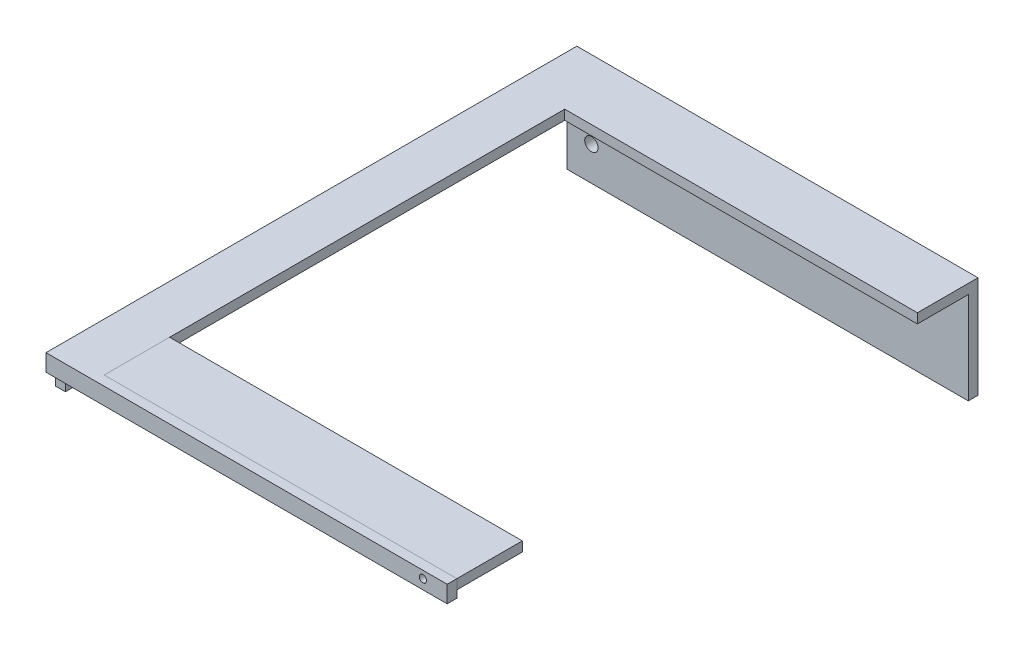
ISO-10303-21;
HEADER;
FILE_DESCRIPTION(('STEP AP214'),'2;1');
FILE_NAME('part.step','',(''),(''),'','','');
FILE_SCHEMA(('AUTOMOTIVE_DESIGN { 1 0 10303 214 1 1 1 1 }'));
ENDSEC;
DATA;
#1=APPLICATION_CONTEXT('core data for automotive mechanical design processes');
#2=APPLICATION_PROTOCOL_DEFINITION('international standard','automotive_design',2000,#1);
#3=PRODUCT_CONTEXT('',#1,'mechanical');
#4=PRODUCT('Part','Part','',(#3));
#5=PRODUCT_RELATED_PRODUCT_CATEGORY('part','',(#4));
#6=PRODUCT_DEFINITION_FORMATION('','',#4);
#7=PRODUCT_DEFINITION_CONTEXT('part definition',#1,'design');
#8=PRODUCT_DEFINITION('design','',#6,#7);
#9=PRODUCT_DEFINITION_SHAPE('','',#8);
#10=(LENGTH_UNIT() NAMED_UNIT(*) SI_UNIT(.MILLI.,.METRE.));
#11=(NAMED_UNIT(*) PLANE_ANGLE_UNIT() SI_UNIT($,.RADIAN.));
#12=(NAMED_UNIT(*) SI_UNIT($,.STERADIAN.) SOLID_ANGLE_UNIT());
#13=UNCERTAINTY_MEASURE_WITH_UNIT(LENGTH_MEASURE(1.E-05),#10,'distance_accuracy_value','');
#14=(GEOMETRIC_REPRESENTATION_CONTEXT(3) GLOBAL_UNCERTAINTY_ASSIGNED_CONTEXT((#13)) GLOBAL_UNIT_ASSIGNED_CONTEXT((#10,
#11,#12)) REPRESENTATION_CONTEXT('',''));
#15=CARTESIAN_POINT('',(0.,0.,0.));
#16=DIRECTION('',(0.,0.,1.));
#17=DIRECTION('',(1.,0.,0.));
#18=AXIS2_PLACEMENT_3D('',#15,#16,#17);
#19=CARTESIAN_POINT('',(20.,0.,215.));
#20=DIRECTION('',(-1.,0.,0.));
#21=DIRECTION('',(0.,0.,1.));
#22=AXIS2_PLACEMENT_3D('',#19,#20,#21);
#23=PLANE('',#22);
#24=DIRECTION('',(0.,0.,1.));
#25=VECTOR('',#24,1.);
#26=CARTESIAN_POINT('',(20.,4.,215.));
#27=LINE('',#26,#25);
#28=CARTESIAN_POINT('',(20.,4.,188.));
#29=VERTEX_POINT('',#28);
#30=CARTESIAN_POINT('',(20.,4.,215.));
#31=VERTEX_POINT('',#30);
#32=EDGE_CURVE('E142',#29,#31,#27,.T.);
#33=ORIENTED_EDGE('',*,*,#32,.F.);
#34=DIRECTION('',(0.,1.,0.));
#35=VECTOR('',#34,1.);
#36=CARTESIAN_POINT('',(20.,0.,188.));
#37=LINE('',#36,#35);
#38=CARTESIAN_POINT('',(20.,0.,188.));
#39=VERTEX_POINT('',#38);
#40=EDGE_CURVE('E77',#39,#29,#37,.T.);
#41=ORIENTED_EDGE('',*,*,#40,.F.);
#42=DIRECTION('',(0.,0.,1.));
#43=VECTOR('',#42,1.);
#44=CARTESIAN_POINT('',(20.,0.,215.));
#45=LINE('',#44,#43);
#46=CARTESIAN_POINT('',(20.,0.,215.));
#47=VERTEX_POINT('',#46);
#48=EDGE_CURVE('E133',#39,#47,#45,.T.);
#49=ORIENTED_EDGE('',*,*,#48,.T.);
#50=DIRECTION('',(0.,1.,0.));
#51=VECTOR('',#50,1.);
#52=CARTESIAN_POINT('',(20.,0.,215.));
#53=LINE('',#52,#51);
#54=EDGE_CURVE('E103',#47,#31,#53,.T.);
#55=ORIENTED_EDGE('',*,*,#54,.T.);
#56=EDGE_LOOP('',(#33,#41,#49,#55));
#57=FACE_BOUND('',#56,.T.);
#58=ADVANCED_FACE('F55',(#57),#23,.T.);
#59=CARTESIAN_POINT('',(20.,0.,188.));
#60=DIRECTION('',(0.,0.,-1.));
#61=DIRECTION('',(-1.,0.,0.));
#62=AXIS2_PLACEMENT_3D('',#59,#60,#61);
#63=PLANE('',#62);
#64=DIRECTION('',(-1.,0.,0.));
#65=VECTOR('',#64,1.);
#66=CARTESIAN_POINT('',(20.,4.,188.));
#67=LINE('',#66,#65);
#68=CARTESIAN_POINT('',(165.5,4.,188.));
#69=VERTEX_POINT('',#68);
#70=EDGE_CURVE('E135',#69,#29,#67,.T.);
#71=ORIENTED_EDGE('',*,*,#70,.F.);
#72=DIRECTION('',(0.,1.,0.));
#73=VECTOR('',#72,1.);
#74=CARTESIAN_POINT('',(165.5,0.,188.));
#75=LINE('',#74,#73);
#76=CARTESIAN_POINT('',(165.5,0.,188.));
#77=VERTEX_POINT('',#76);
#78=EDGE_CURVE('E154',#77,#69,#75,.T.);
#79=ORIENTED_EDGE('',*,*,#78,.F.);
#80=DIRECTION('',(-1.,0.,0.));
#81=VECTOR('',#80,1.);
#82=CARTESIAN_POINT('',(20.,0.,188.));
#83=LINE('',#82,#81);
#84=EDGE_CURVE('E140',#77,#39,#83,.T.);
#85=ORIENTED_EDGE('',*,*,#84,.T.);
#86=ORIENTED_EDGE('',*,*,#40,.T.);
#87=EDGE_LOOP('',(#71,#79,#85,#86));
#88=FACE_BOUND('',#87,.T.);
#89=ADVANCED_FACE('F162',(#88),#63,.T.);
#90=CARTESIAN_POINT('',(165.5,0.,215.));
#91=DIRECTION('',(1.,0.,0.));
#92=DIRECTION('',(0.,0.,-1.));
#93=AXIS2_PLACEMENT_3D('',#90,#91,#92);
#94=PLANE('',#93);
#95=DIRECTION('',(0.,0.,-1.));
#96=VECTOR('',#95,1.);
#97=CARTESIAN_POINT('',(165.5,4.,215.));
#98=LINE('',#97,#96);
#99=CARTESIAN_POINT('',(165.5,4.,215.));
#100=VERTEX_POINT('',#99);
#101=EDGE_CURVE('E148',#100,#69,#98,.T.);
#102=ORIENTED_EDGE('',*,*,#101,.F.);
#103=DIRECTION('',(0.,1.,0.));
#104=VECTOR('',#103,1.);
#105=CARTESIAN_POINT('',(165.5,0.,215.));
#106=LINE('',#105,#104);
#107=CARTESIAN_POINT('',(165.5,0.,215.));
#108=VERTEX_POINT('',#107);
#109=EDGE_CURVE('E156',#108,#100,#106,.T.);
#110=ORIENTED_EDGE('',*,*,#109,.F.);
#111=DIRECTION('',(0.,0.,-1.));
#112=VECTOR('',#111,1.);
#113=CARTESIAN_POINT('',(165.5,0.,215.));
#114=LINE('',#113,#112);
#115=EDGE_CURVE('E130',#108,#77,#114,.T.);
#116=ORIENTED_EDGE('',*,*,#115,.T.);
#117=ORIENTED_EDGE('',*,*,#78,.T.);
#118=EDGE_LOOP('',(#102,#110,#116,#117));
#119=FACE_BOUND('',#118,.T.);
#120=ADVANCED_FACE('F164',(#119),#94,.T.);
#121=CARTESIAN_POINT('',(20.,0.,215.));
#122=DIRECTION('',(0.,0.,1.));
#123=DIRECTION('',(1.,0.,0.));
#124=AXIS2_PLACEMENT_3D('',#121,#122,#123);
#125=PLANE('',#124);
#126=CARTESIAN_POINT('',(155.5,1.,215.));
#127=DIRECTION('',(0.,0.,1.));
#128=DIRECTION('',(1.,0.,0.));
#129=AXIS2_PLACEMENT_3D('',#126,#127,#128);
#130=CIRCLE('',#129,1.5);
#131=CARTESIAN_POINT('',(156.61803398875,0.,215.));
#132=VERTEX_POINT('',#131);
#133=CARTESIAN_POINT('',(154.38196601125,0.,215.));
#134=VERTEX_POINT('',#133);
#135=EDGE_CURVE('E122',#132,#134,#130,.T.);
#136=ORIENTED_EDGE('',*,*,#135,.F.);
#137=DIRECTION('',(1.,0.,0.));
#138=VECTOR('',#137,1.);
#139=CARTESIAN_POINT('',(20.,0.,215.));
#140=LINE('',#139,#138);
#141=EDGE_CURVE('E127',#132,#108,#140,.T.);
#142=ORIENTED_EDGE('',*,*,#141,.T.);
#143=ORIENTED_EDGE('',*,*,#109,.T.);
#144=DIRECTION('',(1.,0.,0.));
#145=VECTOR('',#144,1.);
#146=CARTESIAN_POINT('',(20.,4.,215.));
#147=LINE('',#146,#145);
#148=EDGE_CURVE('E145',#31,#100,#147,.T.);
#149=ORIENTED_EDGE('',*,*,#148,.F.);
#150=ORIENTED_EDGE('',*,*,#54,.F.);
#151=EDGE_CURVE('E132',#47,#134,#140,.T.);
#152=ORIENTED_EDGE('',*,*,#151,.T.);
#153=EDGE_LOOP('',(#136,#142,#143,#149,#150,#152));
#154=FACE_BOUND('',#153,.T.);
#155=ADVANCED_FACE('F158',(#154),#125,.T.);
#156=CARTESIAN_POINT('',(0.,0.,0.));
#157=DIRECTION('',(0.,-1.,0.));
#158=DIRECTION('',(0.,0.,-1.));
#159=AXIS2_PLACEMENT_3D('',#156,#157,#158);
#160=PLANE('',#159);
#161=DIRECTION('',(0.,0.,1.));
#162=VECTOR('',#161,1.);
#163=CARTESIAN_POINT('',(156.61803398875,0.,199.));
#164=LINE('',#163,#162);
#165=CARTESIAN_POINT('',(156.61803398875,0.,199.));
#166=VERTEX_POINT('',#165);
#167=EDGE_CURVE('E12',#166,#132,#164,.T.);
#168=ORIENTED_EDGE('',*,*,#167,.F.);
#169=DIRECTION('',(-1.,0.,0.));
#170=VECTOR('',#169,1.);
#171=CARTESIAN_POINT('',(0.,0.,199.));
#172=LINE('',#171,#170);
#173=CARTESIAN_POINT('',(154.38196601125,0.,199.));
#174=VERTEX_POINT('',#173);
#175=EDGE_CURVE('E113',#166,#174,#172,.T.);
#176=ORIENTED_EDGE('',*,*,#175,.T.);
#177=DIRECTION('',(0.,0.,1.));
#178=VECTOR('',#177,1.);
#179=CARTESIAN_POINT('',(154.38196601125,0.,199.));
#180=LINE('',#179,#178);
#181=EDGE_CURVE('E62',#134,#174,#180,.F.);
#182=ORIENTED_EDGE('',*,*,#181,.F.);
#183=ORIENTED_EDGE('',*,*,#151,.F.);
#184=ORIENTED_EDGE('',*,*,#48,.F.);
#185=ORIENTED_EDGE('',*,*,#84,.F.);
#186=ORIENTED_EDGE('',*,*,#115,.F.);
#187=ORIENTED_EDGE('',*,*,#141,.F.);
#188=EDGE_LOOP('',(#168,#176,#182,#183,#184,#185,#186,#187));
#189=FACE_BOUND('',#188,.T.);
#190=ADVANCED_FACE('F125',(#189),#160,.T.);
#191=CARTESIAN_POINT('',(0.,4.,0.));
#192=DIRECTION('',(0.,-1.,0.));
#193=DIRECTION('',(0.,0.,-1.));
#194=AXIS2_PLACEMENT_3D('',#191,#192,#193);
#195=PLANE('',#194);
#196=ORIENTED_EDGE('',*,*,#32,.T.);
#197=ORIENTED_EDGE('',*,*,#148,.T.);
#198=ORIENTED_EDGE('',*,*,#101,.T.);
#199=ORIENTED_EDGE('',*,*,#70,.T.);
#200=EDGE_LOOP('',(#196,#197,#198,#199));
#201=FACE_BOUND('',#200,.T.);
#202=ADVANCED_FACE('F161',(#201),#195,.F.);
#203=CARTESIAN_POINT('',(155.5,1.,199.));
#204=DIRECTION('',(0.,0.,1.));
#205=DIRECTION('',(1.,0.,0.));
#206=AXIS2_PLACEMENT_3D('',#203,#204,#205);
#207=CYLINDRICAL_SURFACE('',#206,1.5);
#208=ORIENTED_EDGE('',*,*,#167,.T.);
#209=ORIENTED_EDGE('',*,*,#135,.T.);
#210=ORIENTED_EDGE('',*,*,#181,.T.);
#211=CARTESIAN_POINT('',(155.5,1.,199.));
#212=DIRECTION('',(0.,0.,1.));
#213=DIRECTION('',(1.,0.,0.));
#214=AXIS2_PLACEMENT_3D('',#211,#212,#213);
#215=CIRCLE('',#214,1.5);
#216=EDGE_CURVE('E68',#166,#174,#215,.T.);
#217=ORIENTED_EDGE('',*,*,#216,.F.);
#218=EDGE_LOOP('',(#208,#209,#210,#217));
#219=FACE_BOUND('',#218,.T.);
#220=ADVANCED_FACE('F120',(#219),#207,.F.);
#221=CARTESIAN_POINT('',(155.5,1.,199.));
#222=DIRECTION('',(0.,0.,1.));
#223=DIRECTION('',(1.,0.,0.));
#224=AXIS2_PLACEMENT_3D('',#221,#222,#223);
#225=PLANE('',#224);
#226=ORIENTED_EDGE('',*,*,#216,.T.);
#227=ORIENTED_EDGE('',*,*,#175,.F.);
#228=EDGE_LOOP('',(#226,#227));
#229=FACE_BOUND('',#228,.T.);
#230=ADVANCED_FACE('F114',(#229),#225,.T.);
#231=CLOSED_SHELL('',(#58,#89,#120,#155,#190,#202,#220,#230));
#232=MANIFOLD_SOLID_BREP('B2',#231);
#233=CARTESIAN_POINT('',(0.,4.,215.));
#234=DIRECTION('',(0.,0.,-1.));
#235=DIRECTION('',(-1.,0.,0.));
#236=AXIS2_PLACEMENT_3D('',#233,#234,#235);
#237=PLANE('',#236);
#238=DIRECTION('',(1.,0.,0.));
#239=VECTOR('',#238,1.);
#240=CARTESIAN_POINT('',(0.,-3.,215.));
#241=LINE('',#240,#239);
#242=CARTESIAN_POINT('',(0.,-3.,215.));
#243=VERTEX_POINT('',#242);
#244=CARTESIAN_POINT('',(4.,-3.,215.));
#245=VERTEX_POINT('',#244);
#246=EDGE_CURVE('E246',#243,#245,#241,.T.);
#247=ORIENTED_EDGE('',*,*,#246,.F.);
#248=DIRECTION('',(0.,-1.,0.));
#249=VECTOR('',#248,1.);
#250=CARTESIAN_POINT('',(0.,4.,215.));
#251=LINE('',#250,#249);
#252=CARTESIAN_POINT('',(0.,-10.,215.));
#253=VERTEX_POINT('',#252);
#254=EDGE_CURVE('E301',#243,#253,#251,.T.);
#255=ORIENTED_EDGE('',*,*,#254,.T.);
#256=DIRECTION('',(-1.,0.,0.));
#257=VECTOR('',#256,1.);
#258=CARTESIAN_POINT('',(4.,-10.,215.));
#259=LINE('',#258,#257);
#260=CARTESIAN_POINT('',(4.,-10.,215.));
#261=VERTEX_POINT('',#260);
#262=EDGE_CURVE('E324',#261,#253,#259,.T.);
#263=ORIENTED_EDGE('',*,*,#262,.F.);
#264=DIRECTION('',(0.,1.,0.));
#265=VECTOR('',#264,1.);
#266=CARTESIAN_POINT('',(4.,0.,215.));
#267=LINE('',#266,#265);
#268=EDGE_CURVE('E351',#261,#245,#267,.T.);
#269=ORIENTED_EDGE('',*,*,#268,.T.);
#270=EDGE_LOOP('',(#247,#255,#263,#269));
#271=FACE_BOUND('',#270,.T.);
#272=ADVANCED_FACE('F230',(#271),#237,.F.);
#273=CARTESIAN_POINT('',(20.,4.,0.));
#274=DIRECTION('',(-1.,0.,0.));
#275=DIRECTION('',(0.,0.,1.));
#276=AXIS2_PLACEMENT_3D('',#273,#274,#275);
#277=PLANE('',#276);
#278=DIRECTION('',(0.,-1.,0.));
#279=VECTOR('',#278,1.);
#280=CARTESIAN_POINT('',(20.,4.,25.));
#281=LINE('',#280,#279);
#282=CARTESIAN_POINT('',(20.,4.,25.));
#283=VERTEX_POINT('',#282);
#284=CARTESIAN_POINT('',(20.,0.,25.));
#285=VERTEX_POINT('',#284);
#286=EDGE_CURVE('E347',#283,#285,#281,.T.);
#287=ORIENTED_EDGE('',*,*,#286,.F.);
#288=DIRECTION('',(0.,0.,-1.));
#289=VECTOR('',#288,1.);
#290=CARTESIAN_POINT('',(20.,4.,0.));
#291=LINE('',#290,#289);
#292=CARTESIAN_POINT('',(20.,4.,215.));
#293=VERTEX_POINT('',#292);
#294=EDGE_CURVE('E327',#293,#283,#291,.T.);
#295=ORIENTED_EDGE('',*,*,#294,.F.);
#296=DIRECTION('',(0.,-1.,0.));
#297=VECTOR('',#296,1.);
#298=CARTESIAN_POINT('',(20.,4.,215.));
#299=LINE('',#298,#297);
#300=CARTESIAN_POINT('',(20.,0.,215.));
#301=VERTEX_POINT('',#300);
#302=EDGE_CURVE('E311',#293,#301,#299,.T.);
#303=ORIENTED_EDGE('',*,*,#302,.T.);
#304=DIRECTION('',(0.,0.,-1.));
#305=VECTOR('',#304,1.);
#306=CARTESIAN_POINT('',(20.,0.,0.));
#307=LINE('',#306,#305);
#308=EDGE_CURVE('E315',#301,#285,#307,.T.);
#309=ORIENTED_EDGE('',*,*,#308,.T.);
#310=EDGE_LOOP('',(#287,#295,#303,#309));
#311=FACE_BOUND('',#310,.T.);
#312=ADVANCED_FACE('F525',(#311),#277,.F.);
#313=CARTESIAN_POINT('',(0.,0.,0.));
#314=DIRECTION('',(0.,1.,0.));
#315=DIRECTION('',(0.,0.,1.));
#316=AXIS2_PLACEMENT_3D('',#313,#314,#315);
#317=PLANE('',#316);
#318=DIRECTION('',(0.,0.,-1.));
#319=VECTOR('',#318,1.);
#320=CARTESIAN_POINT('',(4.,0.,4.));
#321=LINE('',#320,#319);
#322=CARTESIAN_POINT('',(4.,0.,215.));
#323=VERTEX_POINT('',#322);
#324=CARTESIAN_POINT('',(4.,0.,4.));
#325=VERTEX_POINT('',#324);
#326=EDGE_CURVE('E338',#323,#325,#321,.T.);
#327=ORIENTED_EDGE('',*,*,#326,.T.);
#328=DIRECTION('',(-1.,0.,0.));
#329=VECTOR('',#328,1.);
#330=CARTESIAN_POINT('',(0.,0.,4.));
#331=LINE('',#330,#329);
#332=CARTESIAN_POINT('',(165.5,0.,4.));
#333=VERTEX_POINT('',#332);
#334=EDGE_CURVE('E288',#333,#325,#331,.T.);
#335=ORIENTED_EDGE('',*,*,#334,.F.);
#336=DIRECTION('',(0.,0.,-1.));
#337=VECTOR('',#336,1.);
#338=CARTESIAN_POINT('',(165.5,0.,0.));
#339=LINE('',#338,#337);
#340=CARTESIAN_POINT('',(165.5,0.,25.));
#341=VERTEX_POINT('',#340);
#342=EDGE_CURVE('E370',#341,#333,#339,.T.);
#343=ORIENTED_EDGE('',*,*,#342,.F.);
#344=DIRECTION('',(1.,0.,0.));
#345=VECTOR('',#344,1.);
#346=CARTESIAN_POINT('',(20.,0.,25.));
#347=LINE('',#346,#345);
#348=EDGE_CURVE('E374',#285,#341,#347,.T.);
#349=ORIENTED_EDGE('',*,*,#348,.F.);
#350=ORIENTED_EDGE('',*,*,#308,.F.);
#351=DIRECTION('',(1.,0.,0.));
#352=VECTOR('',#351,1.);
#353=CARTESIAN_POINT('',(0.,0.,215.));
#354=LINE('',#353,#352);
#355=EDGE_CURVE('E320',#323,#301,#354,.T.);
#356=ORIENTED_EDGE('',*,*,#355,.F.);
#357=EDGE_LOOP('',(#327,#335,#343,#349,#350,#356));
#358=FACE_BOUND('',#357,.T.);
#359=ADVANCED_FACE('F530',(#358),#317,.F.);
#360=CARTESIAN_POINT('',(0.,0.,4.));
#361=DIRECTION('',(1.,0.,0.));
#362=DIRECTION('',(0.,1.,0.));
#363=AXIS2_PLACEMENT_3D('',#360,#361,#362);
#364=PLANE('',#363);
#365=DIRECTION('',(0.,-1.,0.));
#366=VECTOR('',#365,1.);
#367=CARTESIAN_POINT('',(0.,0.,4.));
#368=LINE('',#367,#366);
#369=CARTESIAN_POINT('',(0.,-10.,4.));
#370=VERTEX_POINT('',#369);
#371=CARTESIAN_POINT('',(0.,-38.,4.));
#372=VERTEX_POINT('',#371);
#373=EDGE_CURVE('E294',#370,#372,#368,.T.);
#374=ORIENTED_EDGE('',*,*,#373,.F.);
#375=DIRECTION('',(0.,0.,1.));
#376=VECTOR('',#375,1.);
#377=CARTESIAN_POINT('',(0.,-10.,4.));
#378=LINE('',#377,#376);
#379=EDGE_CURVE('E342',#370,#253,#378,.T.);
#380=ORIENTED_EDGE('',*,*,#379,.T.);
#381=ORIENTED_EDGE('',*,*,#254,.F.);
#382=DIRECTION('',(0.,0.,-1.));
#383=VECTOR('',#382,1.);
#384=CARTESIAN_POINT('',(0.,-3.,219.));
#385=LINE('',#384,#383);
#386=CARTESIAN_POINT('',(0.,-3.,219.));
#387=VERTEX_POINT('',#386);
#388=EDGE_CURVE('E388',#387,#243,#385,.T.);
#389=ORIENTED_EDGE('',*,*,#388,.F.);
#390=DIRECTION('',(0.,-1.,0.));
#391=VECTOR('',#390,1.);
#392=CARTESIAN_POINT('',(0.,4.,219.));
#393=LINE('',#392,#391);
#394=CARTESIAN_POINT('',(0.,4.,219.));
#395=VERTEX_POINT('',#394);
#396=EDGE_CURVE('E408',#395,#387,#393,.T.);
#397=ORIENTED_EDGE('',*,*,#396,.F.);
#398=DIRECTION('',(0.,0.,1.));
#399=VECTOR('',#398,1.);
#400=CARTESIAN_POINT('',(0.,4.,0.));
#401=LINE('',#400,#399);
#402=CARTESIAN_POINT('',(0.,4.,0.));
#403=VERTEX_POINT('',#402);
#404=EDGE_CURVE('E319',#403,#395,#401,.T.);
#405=ORIENTED_EDGE('',*,*,#404,.F.);
#406=DIRECTION('',(0.,-1.,0.));
#407=VECTOR('',#406,1.);
#408=CARTESIAN_POINT('',(0.,0.,0.));
#409=LINE('',#408,#407);
#410=CARTESIAN_POINT('',(0.,-38.,0.));
#411=VERTEX_POINT('',#410);
#412=EDGE_CURVE('E277',#403,#411,#409,.T.);
#413=ORIENTED_EDGE('',*,*,#412,.T.);
#414=DIRECTION('',(0.,0.,-1.));
#415=VECTOR('',#414,1.);
#416=CARTESIAN_POINT('',(0.,-38.,4.));
#417=LINE('',#416,#415);
#418=EDGE_CURVE('E53',#372,#411,#417,.T.);
#419=ORIENTED_EDGE('',*,*,#418,.F.);
#420=EDGE_LOOP('',(#374,#380,#381,#389,#397,#405,#413,#419));
#421=FACE_BOUND('',#420,.T.);
#422=ADVANCED_FACE('F232',(#421),#364,.F.);
#423=CARTESIAN_POINT('',(0.,-38.,4.));
#424=DIRECTION('',(0.,1.,0.));
#425=DIRECTION('',(0.,0.,1.));
#426=AXIS2_PLACEMENT_3D('',#423,#424,#425);
#427=PLANE('',#426);
#428=DIRECTION('',(1.,0.,0.));
#429=VECTOR('',#428,1.);
#430=CARTESIAN_POINT('',(0.,-38.,0.));
#431=LINE('',#430,#429);
#432=CARTESIAN_POINT('',(165.5,-38.,0.));
#433=VERTEX_POINT('',#432);
#434=EDGE_CURVE('E266',#411,#433,#431,.T.);
#435=ORIENTED_EDGE('',*,*,#434,.T.);
#436=DIRECTION('',(0.,0.,-1.));
#437=VECTOR('',#436,1.);
#438=CARTESIAN_POINT('',(165.5,-38.,4.));
#439=LINE('',#438,#437);
#440=CARTESIAN_POINT('',(165.5,-38.,4.));
#441=VERTEX_POINT('',#440);
#442=EDGE_CURVE('E239',#441,#433,#439,.T.);
#443=ORIENTED_EDGE('',*,*,#442,.F.);
#444=DIRECTION('',(1.,0.,0.));
#445=VECTOR('',#444,1.);
#446=CARTESIAN_POINT('',(0.,-38.,4.));
#447=LINE('',#446,#445);
#448=EDGE_CURVE('E255',#372,#441,#447,.T.);
#449=ORIENTED_EDGE('',*,*,#448,.F.);
#450=ORIENTED_EDGE('',*,*,#418,.T.);
#451=EDGE_LOOP('',(#435,#443,#449,#450));
#452=FACE_BOUND('',#451,.T.);
#453=ADVANCED_FACE('F268',(#452),#427,.F.);
#454=CARTESIAN_POINT('',(165.5,0.,4.));
#455=DIRECTION('',(-1.,0.,0.));
#456=DIRECTION('',(0.,0.,1.));
#457=AXIS2_PLACEMENT_3D('',#454,#455,#456);
#458=PLANE('',#457);
#459=DIRECTION('',(0.,1.,0.));
#460=VECTOR('',#459,1.);
#461=CARTESIAN_POINT('',(165.5,0.,0.));
#462=LINE('',#461,#460);
#463=CARTESIAN_POINT('',(165.5,4.,0.));
#464=VERTEX_POINT('',#463);
#465=EDGE_CURVE('E276',#433,#464,#462,.T.);
#466=ORIENTED_EDGE('',*,*,#465,.T.);
#467=DIRECTION('',(0.,0.,-1.));
#468=VECTOR('',#467,1.);
#469=CARTESIAN_POINT('',(165.5,4.,0.));
#470=LINE('',#469,#468);
#471=CARTESIAN_POINT('',(165.5,4.,25.));
#472=VERTEX_POINT('',#471);
#473=EDGE_CURVE('E369',#472,#464,#470,.T.);
#474=ORIENTED_EDGE('',*,*,#473,.F.);
#475=DIRECTION('',(0.,-1.,0.));
#476=VECTOR('',#475,1.);
#477=CARTESIAN_POINT('',(165.5,4.,25.));
#478=LINE('',#477,#476);
#479=EDGE_CURVE('E365',#472,#341,#478,.T.);
#480=ORIENTED_EDGE('',*,*,#479,.T.);
#481=ORIENTED_EDGE('',*,*,#342,.T.);
#482=DIRECTION('',(0.,1.,0.));
#483=VECTOR('',#482,1.);
#484=CARTESIAN_POINT('',(165.5,0.,4.));
#485=LINE('',#484,#483);
#486=EDGE_CURVE('E286',#441,#333,#485,.T.);
#487=ORIENTED_EDGE('',*,*,#486,.F.);
#488=ORIENTED_EDGE('',*,*,#442,.T.);
#489=EDGE_LOOP('',(#466,#474,#480,#481,#487,#488));
#490=FACE_BOUND('',#489,.T.);
#491=ADVANCED_FACE('F281',(#490),#458,.F.);
#492=CARTESIAN_POINT('',(0.,0.,4.));
#493=DIRECTION('',(0.,0.,1.));
#494=DIRECTION('',(1.,0.,0.));
#495=AXIS2_PLACEMENT_3D('',#492,#493,#494);
#496=PLANE('',#495);
#497=CARTESIAN_POINT('',(10.,-24.,4.));
#498=DIRECTION('',(0.,0.,-1.));
#499=DIRECTION('',(-1.,0.,0.));
#500=AXIS2_PLACEMENT_3D('',#497,#498,#499);
#501=CIRCLE('',#500,2.75);
#502=CARTESIAN_POINT('',(7.25,-24.,4.));
#503=VERTEX_POINT('',#502);
#504=EDGE_CURVE('E434',#503,#503,#501,.T.);
#505=ORIENTED_EDGE('',*,*,#504,.T.);
#506=EDGE_LOOP('',(#505));
#507=FACE_BOUND('',#506,.T.);
#508=CARTESIAN_POINT('',(140.5,-16.,4.));
#509=DIRECTION('',(0.,0.,-1.));
#510=DIRECTION('',(-1.,0.,0.));
#511=AXIS2_PLACEMENT_3D('',#508,#509,#510);
#512=CIRCLE('',#511,1.5);
#513=CARTESIAN_POINT('',(139.,-16.,4.));
#514=VERTEX_POINT('',#513);
#515=EDGE_CURVE('E378',#514,#514,#512,.T.);
#516=ORIENTED_EDGE('',*,*,#515,.T.);
#517=EDGE_LOOP('',(#516));
#518=FACE_BOUND('',#517,.T.);
#519=DIRECTION('',(-1.,0.,0.));
#520=VECTOR('',#519,1.);
#521=CARTESIAN_POINT('',(4.,-10.,4.));
#522=LINE('',#521,#520);
#523=CARTESIAN_POINT('',(4.,-10.,4.));
#524=VERTEX_POINT('',#523);
#525=EDGE_CURVE('E334',#524,#370,#522,.T.);
#526=ORIENTED_EDGE('',*,*,#525,.T.);
#527=ORIENTED_EDGE('',*,*,#373,.T.);
#528=ORIENTED_EDGE('',*,*,#448,.T.);
#529=ORIENTED_EDGE('',*,*,#486,.T.);
#530=ORIENTED_EDGE('',*,*,#334,.T.);
#531=DIRECTION('',(0.,-1.,0.));
#532=VECTOR('',#531,1.);
#533=CARTESIAN_POINT('',(4.,0.,4.));
#534=LINE('',#533,#532);
#535=EDGE_CURVE('E346',#325,#524,#534,.T.);
#536=ORIENTED_EDGE('',*,*,#535,.T.);
#537=EDGE_LOOP('',(#526,#527,#528,#529,#530,#536));
#538=FACE_BOUND('',#537,.T.);
#539=ADVANCED_FACE('F543',(#507,#518,#538),#496,.T.);
#540=CARTESIAN_POINT('',(0.,0.,0.));
#541=DIRECTION('',(0.,0.,1.));
#542=DIRECTION('',(1.,0.,0.));
#543=AXIS2_PLACEMENT_3D('',#540,#541,#542);
#544=PLANE('',#543);
#545=CARTESIAN_POINT('',(10.,-24.,0.));
#546=DIRECTION('',(0.,0.,-1.));
#547=DIRECTION('',(-1.,0.,0.));
#548=AXIS2_PLACEMENT_3D('',#545,#546,#547);
#549=CIRCLE('',#548,2.75);
#550=CARTESIAN_POINT('',(7.25,-24.,0.));
#551=VERTEX_POINT('',#550);
#552=EDGE_CURVE('E430',#551,#551,#549,.T.);
#553=ORIENTED_EDGE('',*,*,#552,.F.);
#554=EDGE_LOOP('',(#553));
#555=FACE_BOUND('',#554,.T.);
#556=CARTESIAN_POINT('',(140.5,-16.,0.));
#557=DIRECTION('',(0.,0.,-1.));
#558=DIRECTION('',(-1.,0.,0.));
#559=AXIS2_PLACEMENT_3D('',#556,#557,#558);
#560=CIRCLE('',#559,1.5);
#561=CARTESIAN_POINT('',(139.,-16.,0.));
#562=VERTEX_POINT('',#561);
#563=EDGE_CURVE('E384',#562,#562,#560,.T.);
#564=ORIENTED_EDGE('',*,*,#563,.F.);
#565=EDGE_LOOP('',(#564));
#566=FACE_BOUND('',#565,.T.);
#567=ORIENTED_EDGE('',*,*,#412,.F.);
#568=DIRECTION('',(-1.,0.,0.));
#569=VECTOR('',#568,1.);
#570=CARTESIAN_POINT('',(0.,4.,0.));
#571=LINE('',#570,#569);
#572=EDGE_CURVE('E291',#464,#403,#571,.T.);
#573=ORIENTED_EDGE('',*,*,#572,.F.);
#574=ORIENTED_EDGE('',*,*,#465,.F.);
#575=ORIENTED_EDGE('',*,*,#434,.F.);
#576=EDGE_LOOP('',(#567,#573,#574,#575));
#577=FACE_BOUND('',#576,.T.);
#578=ADVANCED_FACE('F289',(#555,#566,#577),#544,.F.);
#579=CARTESIAN_POINT('',(0.,4.,0.));
#580=DIRECTION('',(0.,1.,0.));
#581=DIRECTION('',(0.,0.,1.));
#582=AXIS2_PLACEMENT_3D('',#579,#580,#581);
#583=PLANE('',#582);
#584=ORIENTED_EDGE('',*,*,#404,.T.);
#585=DIRECTION('',(-1.,0.,0.));
#586=VECTOR('',#585,1.);
#587=CARTESIAN_POINT('',(0.,4.,219.));
#588=LINE('',#587,#586);
#589=CARTESIAN_POINT('',(165.5,4.,219.));
#590=VERTEX_POINT('',#589);
#591=EDGE_CURVE('E403',#590,#395,#588,.T.);
#592=ORIENTED_EDGE('',*,*,#591,.F.);
#593=DIRECTION('',(0.,0.,-1.));
#594=VECTOR('',#593,1.);
#595=CARTESIAN_POINT('',(165.5,4.,219.));
#596=LINE('',#595,#594);
#597=CARTESIAN_POINT('',(165.5,4.,215.));
#598=VERTEX_POINT('',#597);
#599=EDGE_CURVE('E399',#590,#598,#596,.T.);
#600=ORIENTED_EDGE('',*,*,#599,.T.);
#601=DIRECTION('',(-1.,0.,0.));
#602=VECTOR('',#601,1.);
#603=CARTESIAN_POINT('',(0.,4.,215.));
#604=LINE('',#603,#602);
#605=EDGE_CURVE('E404',#598,#293,#604,.T.);
#606=ORIENTED_EDGE('',*,*,#605,.T.);
#607=ORIENTED_EDGE('',*,*,#294,.T.);
#608=DIRECTION('',(1.,0.,0.));
#609=VECTOR('',#608,1.);
#610=CARTESIAN_POINT('',(20.,4.,25.));
#611=LINE('',#610,#609);
#612=EDGE_CURVE('E373',#283,#472,#611,.T.);
#613=ORIENTED_EDGE('',*,*,#612,.T.);
#614=ORIENTED_EDGE('',*,*,#473,.T.);
#615=ORIENTED_EDGE('',*,*,#572,.T.);
#616=EDGE_LOOP('',(#584,#592,#600,#606,#607,#613,#614,#615));
#617=FACE_BOUND('',#616,.T.);
#618=ADVANCED_FACE('F551',(#617),#583,.T.);
#619=CARTESIAN_POINT('',(4.,-10.,4.));
#620=DIRECTION('',(0.,-1.,0.));
#621=DIRECTION('',(1.,0.,0.));
#622=AXIS2_PLACEMENT_3D('',#619,#620,#621);
#623=PLANE('',#622);
#624=ORIENTED_EDGE('',*,*,#379,.F.);
#625=ORIENTED_EDGE('',*,*,#525,.F.);
#626=DIRECTION('',(0.,0.,1.));
#627=VECTOR('',#626,1.);
#628=CARTESIAN_POINT('',(4.,-10.,4.));
#629=LINE('',#628,#627);
#630=EDGE_CURVE('E355',#524,#261,#629,.T.);
#631=ORIENTED_EDGE('',*,*,#630,.T.);
#632=ORIENTED_EDGE('',*,*,#262,.T.);
#633=EDGE_LOOP('',(#624,#625,#631,#632));
#634=FACE_BOUND('',#633,.T.);
#635=ADVANCED_FACE('F569',(#634),#623,.T.);
#636=CARTESIAN_POINT('',(4.,0.,0.));
#637=DIRECTION('',(-1.,0.,0.));
#638=DIRECTION('',(0.,-1.,0.));
#639=AXIS2_PLACEMENT_3D('',#636,#637,#638);
#640=PLANE('',#639);
#641=ORIENTED_EDGE('',*,*,#535,.F.);
#642=ORIENTED_EDGE('',*,*,#326,.F.);
#643=EDGE_CURVE('E354',#245,#323,#267,.T.);
#644=ORIENTED_EDGE('',*,*,#643,.F.);
#645=ORIENTED_EDGE('',*,*,#268,.F.);
#646=ORIENTED_EDGE('',*,*,#630,.F.);
#647=EDGE_LOOP('',(#641,#642,#644,#645,#646));
#648=FACE_BOUND('',#647,.T.);
#649=ADVANCED_FACE('F540',(#648),#640,.F.);
#650=CARTESIAN_POINT('',(20.,4.,25.));
#651=DIRECTION('',(0.,0.,-1.));
#652=DIRECTION('',(-1.,0.,0.));
#653=AXIS2_PLACEMENT_3D('',#650,#651,#652);
#654=PLANE('',#653);
#655=ORIENTED_EDGE('',*,*,#348,.T.);
#656=ORIENTED_EDGE('',*,*,#479,.F.);
#657=ORIENTED_EDGE('',*,*,#612,.F.);
#658=ORIENTED_EDGE('',*,*,#286,.T.);
#659=EDGE_LOOP('',(#655,#656,#657,#658));
#660=FACE_BOUND('',#659,.T.);
#661=ADVANCED_FACE('F576',(#660),#654,.F.);
#662=CARTESIAN_POINT('',(140.5,-16.,4.));
#663=DIRECTION('',(0.,0.,-1.));
#664=DIRECTION('',(-1.,0.,0.));
#665=AXIS2_PLACEMENT_3D('',#662,#663,#664);
#666=CYLINDRICAL_SURFACE('',#665,1.5);
#667=ORIENTED_EDGE('',*,*,#515,.F.);
#668=EDGE_LOOP('',(#667));
#669=FACE_BOUND('',#668,.T.);
#670=ORIENTED_EDGE('',*,*,#563,.T.);
#671=EDGE_LOOP('',(#670));
#672=FACE_BOUND('',#671,.T.);
#673=ADVANCED_FACE('F579',(#669,#672),#666,.F.);
#674=CARTESIAN_POINT('',(0.,0.,215.));
#675=DIRECTION('',(0.,0.,1.));
#676=DIRECTION('',(1.,0.,0.));
#677=AXIS2_PLACEMENT_3D('',#674,#675,#676);
#678=PLANE('',#677);
#679=CARTESIAN_POINT('',(155.5,1.,215.));
#680=DIRECTION('',(0.,0.,1.));
#681=DIRECTION('',(1.,0.,0.));
#682=AXIS2_PLACEMENT_3D('',#679,#680,#681);
#683=CIRCLE('',#682,1.5);
#684=CARTESIAN_POINT('',(157.,1.,215.));
#685=VERTEX_POINT('',#684);
#686=EDGE_CURVE('E435',#685,#685,#683,.T.);
#687=ORIENTED_EDGE('',*,*,#686,.T.);
#688=EDGE_LOOP('',(#687));
#689=FACE_BOUND('',#688,.T.);
#690=CARTESIAN_POINT('',(165.5,-3.,215.));
#691=VERTEX_POINT('',#690);
#692=EDGE_CURVE('E415',#245,#691,#241,.T.);
#693=ORIENTED_EDGE('',*,*,#692,.F.);
#694=ORIENTED_EDGE('',*,*,#643,.T.);
#695=ORIENTED_EDGE('',*,*,#355,.T.);
#696=ORIENTED_EDGE('',*,*,#302,.F.);
#697=ORIENTED_EDGE('',*,*,#605,.F.);
#698=DIRECTION('',(0.,1.,0.));
#699=VECTOR('',#698,1.);
#700=CARTESIAN_POINT('',(165.5,4.,215.));
#701=LINE('',#700,#699);
#702=EDGE_CURVE('E409',#691,#598,#701,.T.);
#703=ORIENTED_EDGE('',*,*,#702,.F.);
#704=EDGE_LOOP('',(#693,#694,#695,#696,#697,#703));
#705=FACE_BOUND('',#704,.T.);
#706=ADVANCED_FACE('F533',(#689,#705),#678,.F.);
#707=CARTESIAN_POINT('',(0.,-3.,219.));
#708=DIRECTION('',(0.,1.,0.));
#709=DIRECTION('',(0.,0.,1.));
#710=AXIS2_PLACEMENT_3D('',#707,#708,#709);
#711=PLANE('',#710);
#712=ORIENTED_EDGE('',*,*,#246,.T.);
#713=ORIENTED_EDGE('',*,*,#692,.T.);
#714=DIRECTION('',(0.,0.,-1.));
#715=VECTOR('',#714,1.);
#716=CARTESIAN_POINT('',(165.5,-3.,219.));
#717=LINE('',#716,#715);
#718=CARTESIAN_POINT('',(165.5,-3.,219.));
#719=VERTEX_POINT('',#718);
#720=EDGE_CURVE('E395',#719,#691,#717,.T.);
#721=ORIENTED_EDGE('',*,*,#720,.F.);
#722=DIRECTION('',(1.,0.,0.));
#723=VECTOR('',#722,1.);
#724=CARTESIAN_POINT('',(0.,-3.,219.));
#725=LINE('',#724,#723);
#726=EDGE_CURVE('E423',#387,#719,#725,.T.);
#727=ORIENTED_EDGE('',*,*,#726,.F.);
#728=ORIENTED_EDGE('',*,*,#388,.T.);
#729=EDGE_LOOP('',(#712,#713,#721,#727,#728));
#730=FACE_BOUND('',#729,.T.);
#731=ADVANCED_FACE('F470',(#730),#711,.F.);
#732=CARTESIAN_POINT('',(165.5,4.,219.));
#733=DIRECTION('',(-1.,0.,0.));
#734=DIRECTION('',(0.,0.,1.));
#735=AXIS2_PLACEMENT_3D('',#732,#733,#734);
#736=PLANE('',#735);
#737=ORIENTED_EDGE('',*,*,#702,.T.);
#738=ORIENTED_EDGE('',*,*,#599,.F.);
#739=DIRECTION('',(0.,1.,0.));
#740=VECTOR('',#739,1.);
#741=CARTESIAN_POINT('',(165.5,4.,219.));
#742=LINE('',#741,#740);
#743=EDGE_CURVE('E419',#719,#590,#742,.T.);
#744=ORIENTED_EDGE('',*,*,#743,.F.);
#745=ORIENTED_EDGE('',*,*,#720,.T.);
#746=EDGE_LOOP('',(#737,#738,#744,#745));
#747=FACE_BOUND('',#746,.T.);
#748=ADVANCED_FACE('F454',(#747),#736,.F.);
#749=CARTESIAN_POINT('',(0.,0.,219.));
#750=DIRECTION('',(0.,0.,1.));
#751=DIRECTION('',(1.,0.,0.));
#752=AXIS2_PLACEMENT_3D('',#749,#750,#751);
#753=PLANE('',#752);
#754=CARTESIAN_POINT('',(155.5,1.,219.));
#755=DIRECTION('',(0.,0.,1.));
#756=DIRECTION('',(1.,0.,0.));
#757=AXIS2_PLACEMENT_3D('',#754,#755,#756);
#758=CIRCLE('',#757,1.5);
#759=CARTESIAN_POINT('',(157.,1.,219.));
#760=VERTEX_POINT('',#759);
#761=EDGE_CURVE('E442',#760,#760,#758,.T.);
#762=ORIENTED_EDGE('',*,*,#761,.F.);
#763=EDGE_LOOP('',(#762));
#764=FACE_BOUND('',#763,.T.);
#765=ORIENTED_EDGE('',*,*,#396,.T.);
#766=ORIENTED_EDGE('',*,*,#726,.T.);
#767=ORIENTED_EDGE('',*,*,#743,.T.);
#768=ORIENTED_EDGE('',*,*,#591,.T.);
#769=EDGE_LOOP('',(#765,#766,#767,#768));
#770=FACE_BOUND('',#769,.T.);
#771=ADVANCED_FACE('F450',(#764,#770),#753,.T.);
#772=CARTESIAN_POINT('',(10.,-24.,4.));
#773=DIRECTION('',(0.,0.,-1.));
#774=DIRECTION('',(-1.,0.,0.));
#775=AXIS2_PLACEMENT_3D('',#772,#773,#774);
#776=CYLINDRICAL_SURFACE('',#775,2.75);
#777=ORIENTED_EDGE('',*,*,#504,.F.);
#778=EDGE_LOOP('',(#777));
#779=FACE_BOUND('',#778,.T.);
#780=ORIENTED_EDGE('',*,*,#552,.T.);
#781=EDGE_LOOP('',(#780));
#782=FACE_BOUND('',#781,.T.);
#783=ADVANCED_FACE('F453',(#779,#782),#776,.F.);
#784=CARTESIAN_POINT('',(155.5,1.,199.));
#785=DIRECTION('',(0.,0.,1.));
#786=DIRECTION('',(1.,0.,0.));
#787=AXIS2_PLACEMENT_3D('',#784,#785,#786);
#788=CYLINDRICAL_SURFACE('',#787,1.5);
#789=ORIENTED_EDGE('',*,*,#761,.T.);
#790=EDGE_LOOP('',(#789));
#791=FACE_BOUND('',#790,.T.);
#792=ORIENTED_EDGE('',*,*,#686,.F.);
#793=EDGE_LOOP('',(#792));
#794=FACE_BOUND('',#793,.T.);
#795=ADVANCED_FACE('F447',(#791,#794),#788,.F.);
#796=CLOSED_SHELL('',(#272,#312,#359,#422,#453,#491,#539,#578,#618,#635,#649,#661,#673,#706,
#731,#748,#771,#783,#795));
#797=MANIFOLD_SOLID_BREP('B6',#796);
#798=ADVANCED_BREP_SHAPE_REPRESENTATION('',(#18,#232,#797),#14);
#799=SHAPE_DEFINITION_REPRESENTATION(#9,#798);
ENDSEC;
END-ISO-10303-21;
